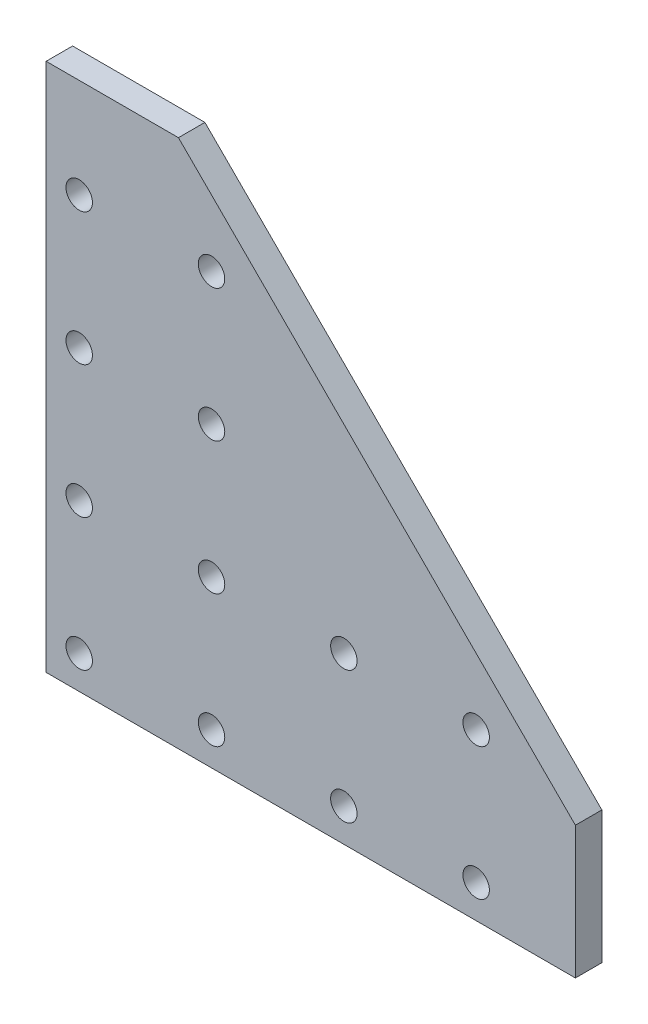
ISO-10303-21;
HEADER;
FILE_DESCRIPTION(('STEP AP214'),'2;1');
FILE_NAME('part.step','',(''),(''),'','','');
FILE_SCHEMA(('AUTOMOTIVE_DESIGN { 1 0 10303 214 1 1 1 1 }'));
ENDSEC;
DATA;
#1=APPLICATION_CONTEXT('core data for automotive mechanical design processes');
#2=APPLICATION_PROTOCOL_DEFINITION('international standard','automotive_design',2000,#1);
#3=PRODUCT_CONTEXT('',#1,'mechanical');
#4=PRODUCT('Part','Part','',(#3));
#5=PRODUCT_RELATED_PRODUCT_CATEGORY('part','',(#4));
#6=PRODUCT_DEFINITION_FORMATION('','',#4);
#7=PRODUCT_DEFINITION_CONTEXT('part definition',#1,'design');
#8=PRODUCT_DEFINITION('design','',#6,#7);
#9=PRODUCT_DEFINITION_SHAPE('','',#8);
#10=(LENGTH_UNIT() NAMED_UNIT(*) SI_UNIT(.MILLI.,.METRE.));
#11=(NAMED_UNIT(*) PLANE_ANGLE_UNIT() SI_UNIT($,.RADIAN.));
#12=(NAMED_UNIT(*) SI_UNIT($,.STERADIAN.) SOLID_ANGLE_UNIT());
#13=UNCERTAINTY_MEASURE_WITH_UNIT(LENGTH_MEASURE(1.E-05),#10,'distance_accuracy_value','');
#14=(GEOMETRIC_REPRESENTATION_CONTEXT(3) GLOBAL_UNCERTAINTY_ASSIGNED_CONTEXT((#13)) GLOBAL_UNIT_ASSIGNED_CONTEXT((#10,
#11,#12)) REPRESENTATION_CONTEXT('',''));
#15=CARTESIAN_POINT('',(0.,0.,0.));
#16=DIRECTION('',(0.,0.,1.));
#17=DIRECTION('',(1.,0.,0.));
#18=AXIS2_PLACEMENT_3D('',#15,#16,#17);
#19=CARTESIAN_POINT('',(0.,0.,8.));
#20=DIRECTION('',(0.,-1.,0.));
#21=DIRECTION('',(1.,0.,0.));
#22=AXIS2_PLACEMENT_3D('',#19,#20,#21);
#23=PLANE('',#22);
#24=DIRECTION('',(-1.,0.,0.));
#25=VECTOR('',#24,1.);
#26=CARTESIAN_POINT('',(0.,0.,0.));
#27=LINE('',#26,#25);
#28=CARTESIAN_POINT('',(160.,0.,0.));
#29=VERTEX_POINT('',#28);
#30=CARTESIAN_POINT('',(0.,0.,0.));
#31=VERTEX_POINT('',#30);
#32=EDGE_CURVE('E175',#29,#31,#27,.T.);
#33=ORIENTED_EDGE('',*,*,#32,.F.);
#34=DIRECTION('',(0.,0.,-1.));
#35=VECTOR('',#34,1.);
#36=CARTESIAN_POINT('',(160.,0.,8.));
#37=LINE('',#36,#35);
#38=CARTESIAN_POINT('',(160.,0.,8.));
#39=VERTEX_POINT('',#38);
#40=EDGE_CURVE('E11',#39,#29,#37,.T.);
#41=ORIENTED_EDGE('',*,*,#40,.F.);
#42=DIRECTION('',(-1.,0.,0.));
#43=VECTOR('',#42,1.);
#44=CARTESIAN_POINT('',(0.,0.,8.));
#45=LINE('',#44,#43);
#46=CARTESIAN_POINT('',(0.,0.,8.));
#47=VERTEX_POINT('',#46);
#48=EDGE_CURVE('E469',#39,#47,#45,.T.);
#49=ORIENTED_EDGE('',*,*,#48,.T.);
#50=DIRECTION('',(0.,0.,-1.));
#51=VECTOR('',#50,1.);
#52=CARTESIAN_POINT('',(0.,0.,8.));
#53=LINE('',#52,#51);
#54=EDGE_CURVE('E65',#47,#31,#53,.T.);
#55=ORIENTED_EDGE('',*,*,#54,.T.);
#56=EDGE_LOOP('',(#33,#41,#49,#55));
#57=FACE_BOUND('',#56,.T.);
#58=ADVANCED_FACE('F47',(#57),#23,.T.);
#59=CARTESIAN_POINT('',(160.,0.,8.));
#60=DIRECTION('',(1.,0.,0.));
#61=DIRECTION('',(0.,0.,-1.));
#62=AXIS2_PLACEMENT_3D('',#59,#60,#61);
#63=PLANE('',#62);
#64=DIRECTION('',(0.,-1.,0.));
#65=VECTOR('',#64,1.);
#66=CARTESIAN_POINT('',(160.,0.,0.));
#67=LINE('',#66,#65);
#68=CARTESIAN_POINT('',(160.,40.,0.));
#69=VERTEX_POINT('',#68);
#70=EDGE_CURVE('E178',#69,#29,#67,.T.);
#71=ORIENTED_EDGE('',*,*,#70,.F.);
#72=DIRECTION('',(0.,0.,-1.));
#73=VECTOR('',#72,1.);
#74=CARTESIAN_POINT('',(160.,40.,8.));
#75=LINE('',#74,#73);
#76=CARTESIAN_POINT('',(160.,40.,8.));
#77=VERTEX_POINT('',#76);
#78=EDGE_CURVE('E57',#77,#69,#75,.T.);
#79=ORIENTED_EDGE('',*,*,#78,.F.);
#80=DIRECTION('',(0.,-1.,0.));
#81=VECTOR('',#80,1.);
#82=CARTESIAN_POINT('',(160.,0.,8.));
#83=LINE('',#82,#81);
#84=EDGE_CURVE('E116',#77,#39,#83,.T.);
#85=ORIENTED_EDGE('',*,*,#84,.T.);
#86=ORIENTED_EDGE('',*,*,#40,.T.);
#87=EDGE_LOOP('',(#71,#79,#85,#86));
#88=FACE_BOUND('',#87,.T.);
#89=ADVANCED_FACE('F226',(#88),#63,.T.);
#90=CARTESIAN_POINT('',(100.000000000001,99.9999999999998,8.));
#91=DIRECTION('',(0.707106781186552,0.707106781186543,0.));
#92=DIRECTION('',(-0.707106781186543,0.707106781186552,0.));
#93=AXIS2_PLACEMENT_3D('',#90,#91,#92);
#94=PLANE('',#93);
#95=DIRECTION('',(0.707106781186543,-0.707106781186552,0.));
#96=VECTOR('',#95,1.);
#97=CARTESIAN_POINT('',(100.000000000001,99.9999999999998,0.));
#98=LINE('',#97,#96);
#99=CARTESIAN_POINT('',(40.,160.000000000001,0.));
#100=VERTEX_POINT('',#99);
#101=EDGE_CURVE('E102',#100,#69,#98,.T.);
#102=ORIENTED_EDGE('',*,*,#101,.F.);
#103=DIRECTION('',(0.,0.,-1.));
#104=VECTOR('',#103,1.);
#105=CARTESIAN_POINT('',(40.,160.000000000001,8.));
#106=LINE('',#105,#104);
#107=CARTESIAN_POINT('',(40.,160.000000000001,8.));
#108=VERTEX_POINT('',#107);
#109=EDGE_CURVE('E97',#108,#100,#106,.T.);
#110=ORIENTED_EDGE('',*,*,#109,.F.);
#111=DIRECTION('',(0.707106781186543,-0.707106781186552,0.));
#112=VECTOR('',#111,1.);
#113=CARTESIAN_POINT('',(100.000000000001,99.9999999999998,8.));
#114=LINE('',#113,#112);
#115=EDGE_CURVE('E100',#108,#77,#114,.T.);
#116=ORIENTED_EDGE('',*,*,#115,.T.);
#117=ORIENTED_EDGE('',*,*,#78,.T.);
#118=EDGE_LOOP('',(#102,#110,#116,#117));
#119=FACE_BOUND('',#118,.T.);
#120=ADVANCED_FACE('F99',(#119),#94,.T.);
#121=CARTESIAN_POINT('',(0.,160.000000000001,8.));
#122=DIRECTION('',(0.,1.,0.));
#123=DIRECTION('',(0.,0.,1.));
#124=AXIS2_PLACEMENT_3D('',#121,#122,#123);
#125=PLANE('',#124);
#126=DIRECTION('',(1.,0.,0.));
#127=VECTOR('',#126,1.);
#128=CARTESIAN_POINT('',(0.,160.000000000001,0.));
#129=LINE('',#128,#127);
#130=CARTESIAN_POINT('',(0.,160.000000000001,0.));
#131=VERTEX_POINT('',#130);
#132=EDGE_CURVE('E184',#131,#100,#129,.T.);
#133=ORIENTED_EDGE('',*,*,#132,.F.);
#134=DIRECTION('',(0.,0.,-1.));
#135=VECTOR('',#134,1.);
#136=CARTESIAN_POINT('',(0.,160.000000000001,8.));
#137=LINE('',#136,#135);
#138=CARTESIAN_POINT('',(0.,160.000000000001,8.));
#139=VERTEX_POINT('',#138);
#140=EDGE_CURVE('E81',#139,#131,#137,.T.);
#141=ORIENTED_EDGE('',*,*,#140,.F.);
#142=DIRECTION('',(1.,0.,0.));
#143=VECTOR('',#142,1.);
#144=CARTESIAN_POINT('',(0.,160.000000000001,8.));
#145=LINE('',#144,#143);
#146=EDGE_CURVE('E114',#139,#108,#145,.T.);
#147=ORIENTED_EDGE('',*,*,#146,.T.);
#148=ORIENTED_EDGE('',*,*,#109,.T.);
#149=EDGE_LOOP('',(#133,#141,#147,#148));
#150=FACE_BOUND('',#149,.T.);
#151=ADVANCED_FACE('F119',(#150),#125,.T.);
#152=CARTESIAN_POINT('',(10.0000000000015,130.,8.));
#153=DIRECTION('',(0.,0.,-1.));
#154=DIRECTION('',(-1.,0.,0.));
#155=AXIS2_PLACEMENT_3D('',#152,#153,#154);
#156=CYLINDRICAL_SURFACE('',#155,4.);
#157=CARTESIAN_POINT('',(10.0000000000015,130.,8.));
#158=DIRECTION('',(0.,0.,1.));
#159=DIRECTION('',(1.,0.,0.));
#160=AXIS2_PLACEMENT_3D('',#157,#158,#159);
#161=CIRCLE('',#160,4.);
#162=CARTESIAN_POINT('',(14.0000000000015,130.,8.));
#163=VERTEX_POINT('',#162);
#164=EDGE_CURVE('E147',#163,#163,#161,.F.);
#165=ORIENTED_EDGE('',*,*,#164,.F.);
#166=EDGE_LOOP('',(#165));
#167=FACE_BOUND('',#166,.T.);
#168=CARTESIAN_POINT('',(10.0000000000015,130.,0.));
#169=DIRECTION('',(0.,0.,1.));
#170=DIRECTION('',(1.,0.,0.));
#171=AXIS2_PLACEMENT_3D('',#168,#169,#170);
#172=CIRCLE('',#171,4.);
#173=CARTESIAN_POINT('',(14.0000000000015,130.,0.));
#174=VERTEX_POINT('',#173);
#175=EDGE_CURVE('E211',#174,#174,#172,.F.);
#176=ORIENTED_EDGE('',*,*,#175,.T.);
#177=EDGE_LOOP('',(#176));
#178=FACE_BOUND('',#177,.T.);
#179=ADVANCED_FACE('F296',(#167,#178),#156,.F.);
#180=CARTESIAN_POINT('',(130.,10.,8.));
#181=DIRECTION('',(0.,0.,-1.));
#182=DIRECTION('',(-1.,0.,0.));
#183=AXIS2_PLACEMENT_3D('',#180,#181,#182);
#184=CYLINDRICAL_SURFACE('',#183,3.99999999999999);
#185=CARTESIAN_POINT('',(130.,10.,8.));
#186=DIRECTION('',(0.,0.,1.));
#187=DIRECTION('',(1.,0.,0.));
#188=AXIS2_PLACEMENT_3D('',#185,#186,#187);
#189=CIRCLE('',#188,3.99999999999999);
#190=CARTESIAN_POINT('',(134.,10.,8.));
#191=VERTEX_POINT('',#190);
#192=EDGE_CURVE('E143',#191,#191,#189,.T.);
#193=ORIENTED_EDGE('',*,*,#192,.T.);
#194=EDGE_LOOP('',(#193));
#195=FACE_BOUND('',#194,.T.);
#196=CARTESIAN_POINT('',(130.,10.,0.));
#197=DIRECTION('',(0.,0.,1.));
#198=DIRECTION('',(1.,0.,0.));
#199=AXIS2_PLACEMENT_3D('',#196,#197,#198);
#200=CIRCLE('',#199,3.99999999999999);
#201=CARTESIAN_POINT('',(134.,10.,0.));
#202=VERTEX_POINT('',#201);
#203=EDGE_CURVE('E207',#202,#202,#200,.T.);
#204=ORIENTED_EDGE('',*,*,#203,.F.);
#205=EDGE_LOOP('',(#204));
#206=FACE_BOUND('',#205,.T.);
#207=ADVANCED_FACE('F299',(#195,#206),#184,.F.);
#208=CARTESIAN_POINT('',(10.000000000001,90.,8.));
#209=DIRECTION('',(0.,0.,-1.));
#210=DIRECTION('',(-1.,0.,0.));
#211=AXIS2_PLACEMENT_3D('',#208,#209,#210);
#212=CYLINDRICAL_SURFACE('',#211,4.);
#213=CARTESIAN_POINT('',(10.000000000001,90.,8.));
#214=DIRECTION('',(0.,0.,1.));
#215=DIRECTION('',(1.,0.,0.));
#216=AXIS2_PLACEMENT_3D('',#213,#214,#215);
#217=CIRCLE('',#216,4.);
#218=CARTESIAN_POINT('',(14.000000000001,90.,8.));
#219=VERTEX_POINT('',#218);
#220=EDGE_CURVE('E139',#219,#219,#217,.F.);
#221=ORIENTED_EDGE('',*,*,#220,.F.);
#222=EDGE_LOOP('',(#221));
#223=FACE_BOUND('',#222,.T.);
#224=CARTESIAN_POINT('',(10.000000000001,90.,0.));
#225=DIRECTION('',(0.,0.,1.));
#226=DIRECTION('',(1.,0.,0.));
#227=AXIS2_PLACEMENT_3D('',#224,#225,#226);
#228=CIRCLE('',#227,4.);
#229=CARTESIAN_POINT('',(14.000000000001,90.,0.));
#230=VERTEX_POINT('',#229);
#231=EDGE_CURVE('E203',#230,#230,#228,.F.);
#232=ORIENTED_EDGE('',*,*,#231,.T.);
#233=EDGE_LOOP('',(#232));
#234=FACE_BOUND('',#233,.T.);
#235=ADVANCED_FACE('F303',(#223,#234),#212,.F.);
#236=CARTESIAN_POINT('',(90.,9.99999999999999,8.));
#237=DIRECTION('',(0.,0.,-1.));
#238=DIRECTION('',(-1.,0.,0.));
#239=AXIS2_PLACEMENT_3D('',#236,#237,#238);
#240=CYLINDRICAL_SURFACE('',#239,4.00000000000001);
#241=CARTESIAN_POINT('',(90.,9.99999999999999,8.));
#242=DIRECTION('',(0.,0.,1.));
#243=DIRECTION('',(1.,0.,0.));
#244=AXIS2_PLACEMENT_3D('',#241,#242,#243);
#245=CIRCLE('',#244,4.00000000000001);
#246=CARTESIAN_POINT('',(94.,9.99999999999999,8.));
#247=VERTEX_POINT('',#246);
#248=EDGE_CURVE('E135',#247,#247,#245,.T.);
#249=ORIENTED_EDGE('',*,*,#248,.T.);
#250=EDGE_LOOP('',(#249));
#251=FACE_BOUND('',#250,.T.);
#252=CARTESIAN_POINT('',(90.,9.99999999999999,0.));
#253=DIRECTION('',(0.,0.,1.));
#254=DIRECTION('',(1.,0.,0.));
#255=AXIS2_PLACEMENT_3D('',#252,#253,#254);
#256=CIRCLE('',#255,4.00000000000001);
#257=CARTESIAN_POINT('',(94.,9.99999999999999,0.));
#258=VERTEX_POINT('',#257);
#259=EDGE_CURVE('E199',#258,#258,#256,.T.);
#260=ORIENTED_EDGE('',*,*,#259,.F.);
#261=EDGE_LOOP('',(#260));
#262=FACE_BOUND('',#261,.T.);
#263=ADVANCED_FACE('F307',(#251,#262),#240,.F.);
#264=CARTESIAN_POINT('',(50.,9.99999999999999,8.));
#265=DIRECTION('',(0.,0.,-1.));
#266=DIRECTION('',(-1.,0.,0.));
#267=AXIS2_PLACEMENT_3D('',#264,#265,#266);
#268=CYLINDRICAL_SURFACE('',#267,4.00000000000001);
#269=CARTESIAN_POINT('',(50.,9.99999999999999,8.));
#270=DIRECTION('',(0.,0.,1.));
#271=DIRECTION('',(1.,0.,0.));
#272=AXIS2_PLACEMENT_3D('',#269,#270,#271);
#273=CIRCLE('',#272,4.00000000000001);
#274=CARTESIAN_POINT('',(54.,9.99999999999999,8.));
#275=VERTEX_POINT('',#274);
#276=EDGE_CURVE('E131',#275,#275,#273,.T.);
#277=ORIENTED_EDGE('',*,*,#276,.T.);
#278=EDGE_LOOP('',(#277));
#279=FACE_BOUND('',#278,.T.);
#280=CARTESIAN_POINT('',(50.,9.99999999999999,0.));
#281=DIRECTION('',(0.,0.,1.));
#282=DIRECTION('',(1.,0.,0.));
#283=AXIS2_PLACEMENT_3D('',#280,#281,#282);
#284=CIRCLE('',#283,4.00000000000001);
#285=CARTESIAN_POINT('',(54.,9.99999999999999,0.));
#286=VERTEX_POINT('',#285);
#287=EDGE_CURVE('E195',#286,#286,#284,.T.);
#288=ORIENTED_EDGE('',*,*,#287,.F.);
#289=EDGE_LOOP('',(#288));
#290=FACE_BOUND('',#289,.T.);
#291=ADVANCED_FACE('F242',(#279,#290),#268,.F.);
#292=CARTESIAN_POINT('',(10.,9.99999999999998,8.));
#293=DIRECTION('',(0.,0.,-1.));
#294=DIRECTION('',(-1.,0.,0.));
#295=AXIS2_PLACEMENT_3D('',#292,#293,#294);
#296=CYLINDRICAL_SURFACE('',#295,4.);
#297=CARTESIAN_POINT('',(10.,9.99999999999998,8.));
#298=DIRECTION('',(0.,0.,1.));
#299=DIRECTION('',(1.,0.,0.));
#300=AXIS2_PLACEMENT_3D('',#297,#298,#299);
#301=CIRCLE('',#300,4.);
#302=CARTESIAN_POINT('',(14.,9.99999999999998,8.));
#303=VERTEX_POINT('',#302);
#304=EDGE_CURVE('E124',#303,#303,#301,.T.);
#305=ORIENTED_EDGE('',*,*,#304,.T.);
#306=EDGE_LOOP('',(#305));
#307=FACE_BOUND('',#306,.T.);
#308=CARTESIAN_POINT('',(10.,9.99999999999998,0.));
#309=DIRECTION('',(0.,0.,1.));
#310=DIRECTION('',(1.,0.,0.));
#311=AXIS2_PLACEMENT_3D('',#308,#309,#310);
#312=CIRCLE('',#311,4.);
#313=CARTESIAN_POINT('',(14.,9.99999999999998,0.));
#314=VERTEX_POINT('',#313);
#315=EDGE_CURVE('E191',#314,#314,#312,.T.);
#316=ORIENTED_EDGE('',*,*,#315,.F.);
#317=EDGE_LOOP('',(#316));
#318=FACE_BOUND('',#317,.T.);
#319=ADVANCED_FACE('F233',(#307,#318),#296,.F.);
#320=CARTESIAN_POINT('',(0.,0.,8.));
#321=DIRECTION('',(-1.,0.,0.));
#322=DIRECTION('',(0.,0.,1.));
#323=AXIS2_PLACEMENT_3D('',#320,#321,#322);
#324=PLANE('',#323);
#325=DIRECTION('',(0.,1.,0.));
#326=VECTOR('',#325,1.);
#327=CARTESIAN_POINT('',(0.,0.,0.));
#328=LINE('',#327,#326);
#329=EDGE_CURVE('E187',#31,#131,#328,.T.);
#330=ORIENTED_EDGE('',*,*,#329,.F.);
#331=ORIENTED_EDGE('',*,*,#54,.F.);
#332=DIRECTION('',(0.,1.,0.));
#333=VECTOR('',#332,1.);
#334=CARTESIAN_POINT('',(0.,0.,8.));
#335=LINE('',#334,#333);
#336=EDGE_CURVE('E121',#47,#139,#335,.T.);
#337=ORIENTED_EDGE('',*,*,#336,.T.);
#338=ORIENTED_EDGE('',*,*,#140,.T.);
#339=EDGE_LOOP('',(#330,#331,#337,#338));
#340=FACE_BOUND('',#339,.T.);
#341=ADVANCED_FACE('F230',(#340),#324,.T.);
#342=CARTESIAN_POINT('',(10.0000000000005,50.,8.));
#343=DIRECTION('',(0.,0.,-1.));
#344=DIRECTION('',(-1.,0.,0.));
#345=AXIS2_PLACEMENT_3D('',#342,#343,#344);
#346=CYLINDRICAL_SURFACE('',#345,4.);
#347=CARTESIAN_POINT('',(10.0000000000005,50.,8.));
#348=DIRECTION('',(0.,0.,1.));
#349=DIRECTION('',(1.,0.,0.));
#350=AXIS2_PLACEMENT_3D('',#347,#348,#349);
#351=CIRCLE('',#350,4.);
#352=CARTESIAN_POINT('',(14.0000000000005,50.,8.));
#353=VERTEX_POINT('',#352);
#354=EDGE_CURVE('E467',#353,#353,#351,.F.);
#355=ORIENTED_EDGE('',*,*,#354,.F.);
#356=EDGE_LOOP('',(#355));
#357=FACE_BOUND('',#356,.T.);
#358=CARTESIAN_POINT('',(10.0000000000005,50.,0.));
#359=DIRECTION('',(0.,0.,1.));
#360=DIRECTION('',(1.,0.,0.));
#361=AXIS2_PLACEMENT_3D('',#358,#359,#360);
#362=CIRCLE('',#361,4.);
#363=CARTESIAN_POINT('',(14.0000000000005,50.,0.));
#364=VERTEX_POINT('',#363);
#365=EDGE_CURVE('E171',#364,#364,#362,.F.);
#366=ORIENTED_EDGE('',*,*,#365,.T.);
#367=EDGE_LOOP('',(#366));
#368=FACE_BOUND('',#367,.T.);
#369=ADVANCED_FACE('F232',(#357,#368),#346,.F.);
#370=CARTESIAN_POINT('',(130.,50.,8.));
#371=DIRECTION('',(0.,0.,-1.));
#372=DIRECTION('',(-1.,0.,0.));
#373=AXIS2_PLACEMENT_3D('',#370,#371,#372);
#374=CYLINDRICAL_SURFACE('',#373,3.99999999999999);
#375=CARTESIAN_POINT('',(130.,50.,8.));
#376=DIRECTION('',(0.,0.,1.));
#377=DIRECTION('',(1.,0.,0.));
#378=AXIS2_PLACEMENT_3D('',#375,#376,#377);
#379=CIRCLE('',#378,3.99999999999999);
#380=CARTESIAN_POINT('',(134.,50.,8.));
#381=VERTEX_POINT('',#380);
#382=EDGE_CURVE('E464',#381,#381,#379,.T.);
#383=ORIENTED_EDGE('',*,*,#382,.T.);
#384=EDGE_LOOP('',(#383));
#385=FACE_BOUND('',#384,.T.);
#386=CARTESIAN_POINT('',(130.,50.,0.));
#387=DIRECTION('',(0.,0.,1.));
#388=DIRECTION('',(1.,0.,0.));
#389=AXIS2_PLACEMENT_3D('',#386,#387,#388);
#390=CIRCLE('',#389,3.99999999999999);
#391=CARTESIAN_POINT('',(134.,50.,0.));
#392=VERTEX_POINT('',#391);
#393=EDGE_CURVE('E167',#392,#392,#390,.T.);
#394=ORIENTED_EDGE('',*,*,#393,.F.);
#395=EDGE_LOOP('',(#394));
#396=FACE_BOUND('',#395,.T.);
#397=ADVANCED_FACE('F239',(#385,#396),#374,.F.);
#398=CARTESIAN_POINT('',(90.,50.,8.));
#399=DIRECTION('',(0.,0.,-1.));
#400=DIRECTION('',(-1.,0.,0.));
#401=AXIS2_PLACEMENT_3D('',#398,#399,#400);
#402=CYLINDRICAL_SURFACE('',#401,4.00000000000001);
#403=CARTESIAN_POINT('',(90.,50.,8.));
#404=DIRECTION('',(0.,0.,1.));
#405=DIRECTION('',(1.,0.,0.));
#406=AXIS2_PLACEMENT_3D('',#403,#404,#405);
#407=CIRCLE('',#406,4.00000000000001);
#408=CARTESIAN_POINT('',(94.,50.,8.));
#409=VERTEX_POINT('',#408);
#410=EDGE_CURVE('E460',#409,#409,#407,.T.);
#411=ORIENTED_EDGE('',*,*,#410,.T.);
#412=EDGE_LOOP('',(#411));
#413=FACE_BOUND('',#412,.T.);
#414=CARTESIAN_POINT('',(90.,50.,0.));
#415=DIRECTION('',(0.,0.,1.));
#416=DIRECTION('',(1.,0.,0.));
#417=AXIS2_PLACEMENT_3D('',#414,#415,#416);
#418=CIRCLE('',#417,4.00000000000001);
#419=CARTESIAN_POINT('',(94.,50.,0.));
#420=VERTEX_POINT('',#419);
#421=EDGE_CURVE('E163',#420,#420,#418,.T.);
#422=ORIENTED_EDGE('',*,*,#421,.F.);
#423=EDGE_LOOP('',(#422));
#424=FACE_BOUND('',#423,.T.);
#425=ADVANCED_FACE('F256',(#413,#424),#402,.F.);
#426=CARTESIAN_POINT('',(50.,50.,8.));
#427=DIRECTION('',(0.,0.,-1.));
#428=DIRECTION('',(-1.,0.,0.));
#429=AXIS2_PLACEMENT_3D('',#426,#427,#428);
#430=CYLINDRICAL_SURFACE('',#429,4.00000000000001);
#431=CARTESIAN_POINT('',(50.,50.,8.));
#432=DIRECTION('',(0.,0.,1.));
#433=DIRECTION('',(1.,0.,0.));
#434=AXIS2_PLACEMENT_3D('',#431,#432,#433);
#435=CIRCLE('',#434,4.00000000000001);
#436=CARTESIAN_POINT('',(54.,50.,8.));
#437=VERTEX_POINT('',#436);
#438=EDGE_CURVE('E271',#437,#437,#435,.T.);
#439=ORIENTED_EDGE('',*,*,#438,.T.);
#440=EDGE_LOOP('',(#439));
#441=FACE_BOUND('',#440,.T.);
#442=CARTESIAN_POINT('',(50.,50.,0.));
#443=DIRECTION('',(0.,0.,1.));
#444=DIRECTION('',(1.,0.,0.));
#445=AXIS2_PLACEMENT_3D('',#442,#443,#444);
#446=CIRCLE('',#445,4.00000000000001);
#447=CARTESIAN_POINT('',(54.,50.,0.));
#448=VERTEX_POINT('',#447);
#449=EDGE_CURVE('E159',#448,#448,#446,.T.);
#450=ORIENTED_EDGE('',*,*,#449,.F.);
#451=EDGE_LOOP('',(#450));
#452=FACE_BOUND('',#451,.T.);
#453=ADVANCED_FACE('F259',(#441,#452),#430,.F.);
#454=CARTESIAN_POINT('',(50.0000000000015,130.,8.));
#455=DIRECTION('',(0.,0.,-1.));
#456=DIRECTION('',(-1.,0.,0.));
#457=AXIS2_PLACEMENT_3D('',#454,#455,#456);
#458=CYLINDRICAL_SURFACE('',#457,4.);
#459=CARTESIAN_POINT('',(50.0000000000015,130.,8.));
#460=DIRECTION('',(0.,0.,1.));
#461=DIRECTION('',(1.,0.,0.));
#462=AXIS2_PLACEMENT_3D('',#459,#460,#461);
#463=CIRCLE('',#462,4.);
#464=CARTESIAN_POINT('',(54.0000000000015,130.,8.));
#465=VERTEX_POINT('',#464);
#466=EDGE_CURVE('E219',#465,#465,#463,.F.);
#467=ORIENTED_EDGE('',*,*,#466,.F.);
#468=EDGE_LOOP('',(#467));
#469=FACE_BOUND('',#468,.T.);
#470=CARTESIAN_POINT('',(50.0000000000015,130.,0.));
#471=DIRECTION('',(0.,0.,1.));
#472=DIRECTION('',(1.,0.,0.));
#473=AXIS2_PLACEMENT_3D('',#470,#471,#472);
#474=CIRCLE('',#473,4.);
#475=CARTESIAN_POINT('',(54.0000000000015,130.,0.));
#476=VERTEX_POINT('',#475);
#477=EDGE_CURVE('E155',#476,#476,#474,.F.);
#478=ORIENTED_EDGE('',*,*,#477,.T.);
#479=EDGE_LOOP('',(#478));
#480=FACE_BOUND('',#479,.T.);
#481=ADVANCED_FACE('F49',(#469,#480),#458,.F.);
#482=CARTESIAN_POINT('',(50.000000000001,90.,8.));
#483=DIRECTION('',(0.,0.,-1.));
#484=DIRECTION('',(-1.,0.,0.));
#485=AXIS2_PLACEMENT_3D('',#482,#483,#484);
#486=CYLINDRICAL_SURFACE('',#485,4.);
#487=CARTESIAN_POINT('',(50.000000000001,90.,8.));
#488=DIRECTION('',(0.,0.,1.));
#489=DIRECTION('',(1.,0.,0.));
#490=AXIS2_PLACEMENT_3D('',#487,#488,#489);
#491=CIRCLE('',#490,4.);
#492=CARTESIAN_POINT('',(54.000000000001,90.,8.));
#493=VERTEX_POINT('',#492);
#494=EDGE_CURVE('E151',#493,#493,#491,.F.);
#495=ORIENTED_EDGE('',*,*,#494,.F.);
#496=EDGE_LOOP('',(#495));
#497=FACE_BOUND('',#496,.T.);
#498=CARTESIAN_POINT('',(50.000000000001,90.,0.));
#499=DIRECTION('',(0.,0.,1.));
#500=DIRECTION('',(1.,0.,0.));
#501=AXIS2_PLACEMENT_3D('',#498,#499,#500);
#502=CIRCLE('',#501,4.);
#503=CARTESIAN_POINT('',(54.000000000001,90.,0.));
#504=VERTEX_POINT('',#503);
#505=EDGE_CURVE('E215',#504,#504,#502,.F.);
#506=ORIENTED_EDGE('',*,*,#505,.T.);
#507=EDGE_LOOP('',(#506));
#508=FACE_BOUND('',#507,.T.);
#509=ADVANCED_FACE('F266',(#497,#508),#486,.F.);
#510=CARTESIAN_POINT('',(0.,0.,8.));
#511=DIRECTION('',(0.,0.,1.));
#512=DIRECTION('',(1.,0.,0.));
#513=AXIS2_PLACEMENT_3D('',#510,#511,#512);
#514=PLANE('',#513);
#515=ORIENTED_EDGE('',*,*,#466,.T.);
#516=EDGE_LOOP('',(#515));
#517=FACE_BOUND('',#516,.T.);
#518=ORIENTED_EDGE('',*,*,#438,.F.);
#519=EDGE_LOOP('',(#518));
#520=FACE_BOUND('',#519,.T.);
#521=ORIENTED_EDGE('',*,*,#410,.F.);
#522=EDGE_LOOP('',(#521));
#523=FACE_BOUND('',#522,.T.);
#524=ORIENTED_EDGE('',*,*,#382,.F.);
#525=EDGE_LOOP('',(#524));
#526=FACE_BOUND('',#525,.T.);
#527=ORIENTED_EDGE('',*,*,#354,.T.);
#528=EDGE_LOOP('',(#527));
#529=FACE_BOUND('',#528,.T.);
#530=ORIENTED_EDGE('',*,*,#48,.F.);
#531=ORIENTED_EDGE('',*,*,#84,.F.);
#532=ORIENTED_EDGE('',*,*,#115,.F.);
#533=ORIENTED_EDGE('',*,*,#146,.F.);
#534=ORIENTED_EDGE('',*,*,#336,.F.);
#535=EDGE_LOOP('',(#530,#531,#532,#533,#534));
#536=FACE_BOUND('',#535,.T.);
#537=ORIENTED_EDGE('',*,*,#304,.F.);
#538=EDGE_LOOP('',(#537));
#539=FACE_BOUND('',#538,.T.);
#540=ORIENTED_EDGE('',*,*,#276,.F.);
#541=EDGE_LOOP('',(#540));
#542=FACE_BOUND('',#541,.T.);
#543=ORIENTED_EDGE('',*,*,#248,.F.);
#544=EDGE_LOOP('',(#543));
#545=FACE_BOUND('',#544,.T.);
#546=ORIENTED_EDGE('',*,*,#220,.T.);
#547=EDGE_LOOP('',(#546));
#548=FACE_BOUND('',#547,.T.);
#549=ORIENTED_EDGE('',*,*,#192,.F.);
#550=EDGE_LOOP('',(#549));
#551=FACE_BOUND('',#550,.T.);
#552=ORIENTED_EDGE('',*,*,#164,.T.);
#553=EDGE_LOOP('',(#552));
#554=FACE_BOUND('',#553,.T.);
#555=ORIENTED_EDGE('',*,*,#494,.T.);
#556=EDGE_LOOP('',(#555));
#557=FACE_BOUND('',#556,.T.);
#558=ADVANCED_FACE('F111',(#517,#520,#523,#526,#529,#536,#539,#542,#545,#548,#551,#554,#557),
#514,.T.);
#559=CARTESIAN_POINT('',(0.,0.,0.));
#560=DIRECTION('',(0.,0.,1.));
#561=DIRECTION('',(1.,0.,0.));
#562=AXIS2_PLACEMENT_3D('',#559,#560,#561);
#563=PLANE('',#562);
#564=ORIENTED_EDGE('',*,*,#477,.F.);
#565=EDGE_LOOP('',(#564));
#566=FACE_BOUND('',#565,.T.);
#567=ORIENTED_EDGE('',*,*,#449,.T.);
#568=EDGE_LOOP('',(#567));
#569=FACE_BOUND('',#568,.T.);
#570=ORIENTED_EDGE('',*,*,#421,.T.);
#571=EDGE_LOOP('',(#570));
#572=FACE_BOUND('',#571,.T.);
#573=ORIENTED_EDGE('',*,*,#393,.T.);
#574=EDGE_LOOP('',(#573));
#575=FACE_BOUND('',#574,.T.);
#576=ORIENTED_EDGE('',*,*,#365,.F.);
#577=EDGE_LOOP('',(#576));
#578=FACE_BOUND('',#577,.T.);
#579=ORIENTED_EDGE('',*,*,#32,.T.);
#580=ORIENTED_EDGE('',*,*,#329,.T.);
#581=ORIENTED_EDGE('',*,*,#132,.T.);
#582=ORIENTED_EDGE('',*,*,#101,.T.);
#583=ORIENTED_EDGE('',*,*,#70,.T.);
#584=EDGE_LOOP('',(#579,#580,#581,#582,#583));
#585=FACE_BOUND('',#584,.T.);
#586=ORIENTED_EDGE('',*,*,#315,.T.);
#587=EDGE_LOOP('',(#586));
#588=FACE_BOUND('',#587,.T.);
#589=ORIENTED_EDGE('',*,*,#287,.T.);
#590=EDGE_LOOP('',(#589));
#591=FACE_BOUND('',#590,.T.);
#592=ORIENTED_EDGE('',*,*,#259,.T.);
#593=EDGE_LOOP('',(#592));
#594=FACE_BOUND('',#593,.T.);
#595=ORIENTED_EDGE('',*,*,#231,.F.);
#596=EDGE_LOOP('',(#595));
#597=FACE_BOUND('',#596,.T.);
#598=ORIENTED_EDGE('',*,*,#203,.T.);
#599=EDGE_LOOP('',(#598));
#600=FACE_BOUND('',#599,.T.);
#601=ORIENTED_EDGE('',*,*,#175,.F.);
#602=EDGE_LOOP('',(#601));
#603=FACE_BOUND('',#602,.T.);
#604=ORIENTED_EDGE('',*,*,#505,.F.);
#605=EDGE_LOOP('',(#604));
#606=FACE_BOUND('',#605,.T.);
#607=ADVANCED_FACE('F228',(#566,#569,#572,#575,#578,#585,#588,#591,#594,#597,#600,#603,#606),
#563,.F.);
#608=CLOSED_SHELL('',(#58,#89,#120,#151,#179,#207,#235,#263,#291,#319,#341,#369,#397,#425,#453,
#481,#509,#558,#607));
#609=MANIFOLD_SOLID_BREP('B2',#608);
#610=ADVANCED_BREP_SHAPE_REPRESENTATION('',(#18,#609),#14);
#611=SHAPE_DEFINITION_REPRESENTATION(#9,#610);
ENDSEC;
END-ISO-10303-21;
